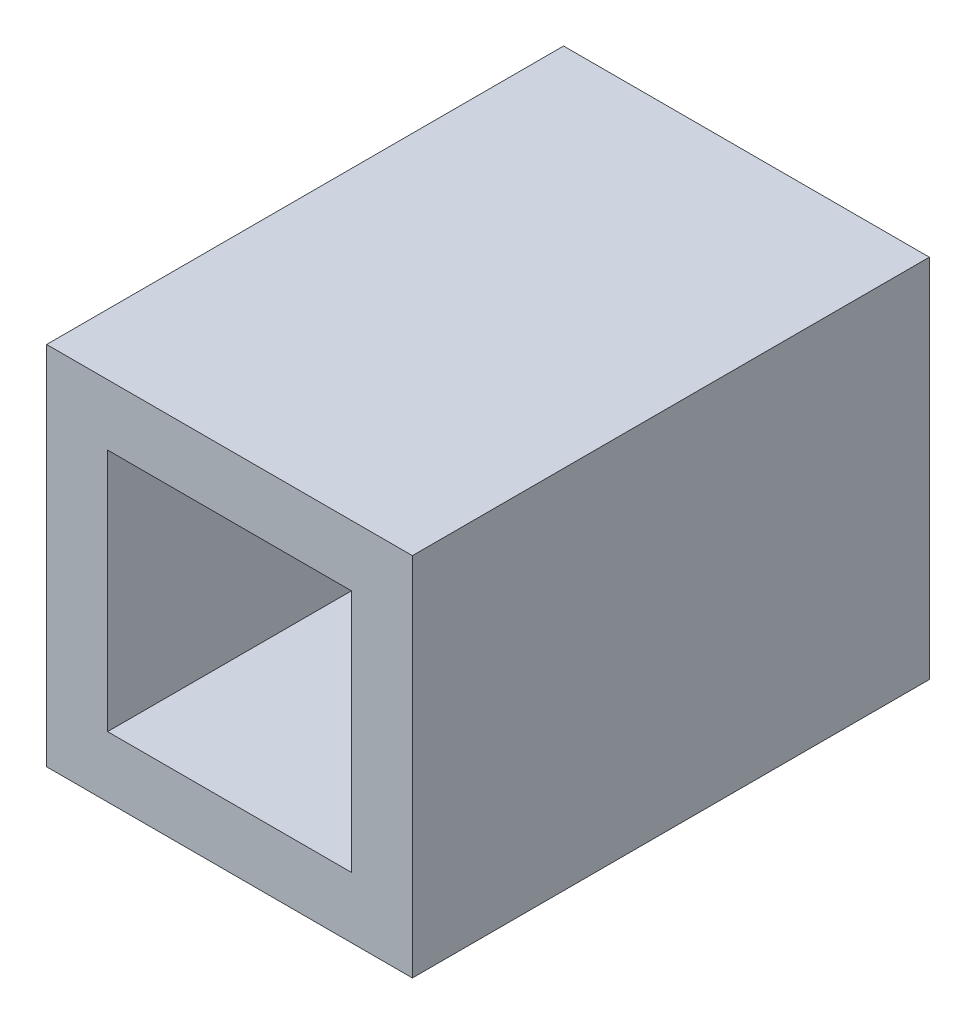
ISO-10303-21;
HEADER;
FILE_DESCRIPTION(('STEP AP214'),'2;1');
FILE_NAME('part.step','',(''),(''),'','','');
FILE_SCHEMA(('AUTOMOTIVE_DESIGN { 1 0 10303 214 1 1 1 1 }'));
ENDSEC;
DATA;
#1=APPLICATION_CONTEXT('core data for automotive mechanical design processes');
#2=APPLICATION_PROTOCOL_DEFINITION('international standard','automotive_design',2000,#1);
#3=PRODUCT_CONTEXT('',#1,'mechanical');
#4=PRODUCT('Part','Part','',(#3));
#5=PRODUCT_RELATED_PRODUCT_CATEGORY('part','',(#4));
#6=PRODUCT_DEFINITION_FORMATION('','',#4);
#7=PRODUCT_DEFINITION_CONTEXT('part definition',#1,'design');
#8=PRODUCT_DEFINITION('design','',#6,#7);
#9=PRODUCT_DEFINITION_SHAPE('','',#8);
#10=(LENGTH_UNIT() NAMED_UNIT(*) SI_UNIT(.MILLI.,.METRE.));
#11=(NAMED_UNIT(*) PLANE_ANGLE_UNIT() SI_UNIT($,.RADIAN.));
#12=(NAMED_UNIT(*) SI_UNIT($,.STERADIAN.) SOLID_ANGLE_UNIT());
#13=UNCERTAINTY_MEASURE_WITH_UNIT(LENGTH_MEASURE(1.E-05),#10,'distance_accuracy_value','');
#14=(GEOMETRIC_REPRESENTATION_CONTEXT(3) GLOBAL_UNCERTAINTY_ASSIGNED_CONTEXT((#13)) GLOBAL_UNIT_ASSIGNED_CONTEXT((#10,
#11,#12)) REPRESENTATION_CONTEXT('',''));
#15=CARTESIAN_POINT('',(0.,0.,0.));
#16=DIRECTION('',(0.,0.,1.));
#17=DIRECTION('',(1.,0.,0.));
#18=AXIS2_PLACEMENT_3D('',#15,#16,#17);
#19=CARTESIAN_POINT('',(0.,0.,42.4));
#20=DIRECTION('',(0.,0.,1.));
#21=DIRECTION('',(1.,0.,0.));
#22=AXIS2_PLACEMENT_3D('',#19,#20,#21);
#23=PLANE('',#22);
#24=DIRECTION('',(0.,1.,0.));
#25=VECTOR('',#24,1.);
#26=CARTESIAN_POINT('',(15.,15.,42.4));
#27=LINE('',#26,#25);
#28=CARTESIAN_POINT('',(15.,-15.,42.4));
#29=VERTEX_POINT('',#28);
#30=CARTESIAN_POINT('',(15.,15.,42.4));
#31=VERTEX_POINT('',#30);
#32=EDGE_CURVE('E134',#29,#31,#27,.T.);
#33=ORIENTED_EDGE('',*,*,#32,.T.);
#34=DIRECTION('',(-1.,0.,0.));
#35=VECTOR('',#34,1.);
#36=CARTESIAN_POINT('',(-15.,15.,42.4));
#37=LINE('',#36,#35);
#38=CARTESIAN_POINT('',(-15.,15.,42.4));
#39=VERTEX_POINT('',#38);
#40=EDGE_CURVE('E137',#31,#39,#37,.T.);
#41=ORIENTED_EDGE('',*,*,#40,.T.);
#42=DIRECTION('',(0.,-1.,0.));
#43=VECTOR('',#42,1.);
#44=CARTESIAN_POINT('',(-15.,15.,42.4));
#45=LINE('',#44,#43);
#46=CARTESIAN_POINT('',(-15.,-15.,42.4));
#47=VERTEX_POINT('',#46);
#48=EDGE_CURVE('E140',#39,#47,#45,.T.);
#49=ORIENTED_EDGE('',*,*,#48,.T.);
#50=DIRECTION('',(1.,0.,0.));
#51=VECTOR('',#50,1.);
#52=CARTESIAN_POINT('',(-15.,-15.,42.4));
#53=LINE('',#52,#51);
#54=EDGE_CURVE('E142',#47,#29,#53,.T.);
#55=ORIENTED_EDGE('',*,*,#54,.T.);
#56=EDGE_LOOP('',(#33,#41,#49,#55));
#57=FACE_BOUND('',#56,.T.);
#58=DIRECTION('',(-1.,0.,0.));
#59=VECTOR('',#58,1.);
#60=CARTESIAN_POINT('',(-10.,10.,42.4));
#61=LINE('',#60,#59);
#62=CARTESIAN_POINT('',(10.,10.,42.4));
#63=VERTEX_POINT('',#62);
#64=CARTESIAN_POINT('',(-10.,10.,42.4));
#65=VERTEX_POINT('',#64);
#66=EDGE_CURVE('E106',#63,#65,#61,.T.);
#67=ORIENTED_EDGE('',*,*,#66,.F.);
#68=DIRECTION('',(0.,1.,0.));
#69=VECTOR('',#68,1.);
#70=CARTESIAN_POINT('',(10.,10.,42.4));
#71=LINE('',#70,#69);
#72=CARTESIAN_POINT('',(10.,-10.,42.4));
#73=VERTEX_POINT('',#72);
#74=EDGE_CURVE('E98',#73,#63,#71,.T.);
#75=ORIENTED_EDGE('',*,*,#74,.F.);
#76=DIRECTION('',(1.,0.,0.));
#77=VECTOR('',#76,1.);
#78=CARTESIAN_POINT('',(-10.,-10.,42.4));
#79=LINE('',#78,#77);
#80=CARTESIAN_POINT('',(-10.,-10.,42.4));
#81=VERTEX_POINT('',#80);
#82=EDGE_CURVE('E120',#81,#73,#79,.T.);
#83=ORIENTED_EDGE('',*,*,#82,.F.);
#84=DIRECTION('',(0.,-1.,0.));
#85=VECTOR('',#84,1.);
#86=CARTESIAN_POINT('',(-10.,10.,42.4));
#87=LINE('',#86,#85);
#88=EDGE_CURVE('E118',#65,#81,#87,.T.);
#89=ORIENTED_EDGE('',*,*,#88,.F.);
#90=EDGE_LOOP('',(#67,#75,#83,#89));
#91=FACE_BOUND('',#90,.T.);
#92=ADVANCED_FACE('F33',(#57,#91),#23,.T.);
#93=CARTESIAN_POINT('',(0.,0.,0.));
#94=DIRECTION('',(0.,0.,1.));
#95=DIRECTION('',(1.,0.,0.));
#96=AXIS2_PLACEMENT_3D('',#93,#94,#95);
#97=PLANE('',#96);
#98=DIRECTION('',(0.,1.,0.));
#99=VECTOR('',#98,1.);
#100=CARTESIAN_POINT('',(15.,15.,0.));
#101=LINE('',#100,#99);
#102=CARTESIAN_POINT('',(15.,-15.,0.));
#103=VERTEX_POINT('',#102);
#104=CARTESIAN_POINT('',(15.,15.,0.));
#105=VERTEX_POINT('',#104);
#106=EDGE_CURVE('E114',#103,#105,#101,.T.);
#107=ORIENTED_EDGE('',*,*,#106,.F.);
#108=DIRECTION('',(1.,0.,0.));
#109=VECTOR('',#108,1.);
#110=CARTESIAN_POINT('',(-15.,-15.,0.));
#111=LINE('',#110,#109);
#112=CARTESIAN_POINT('',(-15.,-15.,0.));
#113=VERTEX_POINT('',#112);
#114=EDGE_CURVE('E138',#113,#103,#111,.T.);
#115=ORIENTED_EDGE('',*,*,#114,.F.);
#116=DIRECTION('',(0.,-1.,0.));
#117=VECTOR('',#116,1.);
#118=CARTESIAN_POINT('',(-15.,15.,0.));
#119=LINE('',#118,#117);
#120=CARTESIAN_POINT('',(-15.,15.,0.));
#121=VERTEX_POINT('',#120);
#122=EDGE_CURVE('E149',#121,#113,#119,.T.);
#123=ORIENTED_EDGE('',*,*,#122,.F.);
#124=DIRECTION('',(-1.,0.,0.));
#125=VECTOR('',#124,1.);
#126=CARTESIAN_POINT('',(-15.,15.,0.));
#127=LINE('',#126,#125);
#128=EDGE_CURVE('E147',#105,#121,#127,.T.);
#129=ORIENTED_EDGE('',*,*,#128,.F.);
#130=EDGE_LOOP('',(#107,#115,#123,#129));
#131=FACE_BOUND('',#130,.T.);
#132=DIRECTION('',(0.,1.,0.));
#133=VECTOR('',#132,1.);
#134=CARTESIAN_POINT('',(10.,10.,0.));
#135=LINE('',#134,#133);
#136=CARTESIAN_POINT('',(10.,-10.,0.));
#137=VERTEX_POINT('',#136);
#138=CARTESIAN_POINT('',(10.,10.,0.));
#139=VERTEX_POINT('',#138);
#140=EDGE_CURVE('E56',#137,#139,#135,.T.);
#141=ORIENTED_EDGE('',*,*,#140,.T.);
#142=DIRECTION('',(-1.,0.,0.));
#143=VECTOR('',#142,1.);
#144=CARTESIAN_POINT('',(-10.,10.,0.));
#145=LINE('',#144,#143);
#146=CARTESIAN_POINT('',(-10.,10.,0.));
#147=VERTEX_POINT('',#146);
#148=EDGE_CURVE('E113',#139,#147,#145,.T.);
#149=ORIENTED_EDGE('',*,*,#148,.T.);
#150=DIRECTION('',(0.,-1.,0.));
#151=VECTOR('',#150,1.);
#152=CARTESIAN_POINT('',(-10.,10.,0.));
#153=LINE('',#152,#151);
#154=CARTESIAN_POINT('',(-10.,-10.,0.));
#155=VERTEX_POINT('',#154);
#156=EDGE_CURVE('E126',#147,#155,#153,.T.);
#157=ORIENTED_EDGE('',*,*,#156,.T.);
#158=DIRECTION('',(1.,0.,0.));
#159=VECTOR('',#158,1.);
#160=CARTESIAN_POINT('',(-10.,-10.,0.));
#161=LINE('',#160,#159);
#162=EDGE_CURVE('E107',#155,#137,#161,.T.);
#163=ORIENTED_EDGE('',*,*,#162,.T.);
#164=EDGE_LOOP('',(#141,#149,#157,#163));
#165=FACE_BOUND('',#164,.T.);
#166=ADVANCED_FACE('F167',(#131,#165),#97,.F.);
#167=CARTESIAN_POINT('',(15.,15.,42.4));
#168=DIRECTION('',(-1.,0.,0.));
#169=DIRECTION('',(0.,0.,1.));
#170=AXIS2_PLACEMENT_3D('',#167,#168,#169);
#171=PLANE('',#170);
#172=ORIENTED_EDGE('',*,*,#106,.T.);
#173=DIRECTION('',(0.,0.,-1.));
#174=VECTOR('',#173,1.);
#175=CARTESIAN_POINT('',(15.,15.,42.4));
#176=LINE('',#175,#174);
#177=EDGE_CURVE('E11',#31,#105,#176,.T.);
#178=ORIENTED_EDGE('',*,*,#177,.F.);
#179=ORIENTED_EDGE('',*,*,#32,.F.);
#180=DIRECTION('',(0.,0.,-1.));
#181=VECTOR('',#180,1.);
#182=CARTESIAN_POINT('',(15.,-15.,42.4));
#183=LINE('',#182,#181);
#184=EDGE_CURVE('E144',#29,#103,#183,.T.);
#185=ORIENTED_EDGE('',*,*,#184,.T.);
#186=EDGE_LOOP('',(#172,#178,#179,#185));
#187=FACE_BOUND('',#186,.T.);
#188=ADVANCED_FACE('F35',(#187),#171,.F.);
#189=CARTESIAN_POINT('',(-15.,15.,42.4));
#190=DIRECTION('',(0.,-1.,0.));
#191=DIRECTION('',(0.,0.,-1.));
#192=AXIS2_PLACEMENT_3D('',#189,#190,#191);
#193=PLANE('',#192);
#194=ORIENTED_EDGE('',*,*,#128,.T.);
#195=DIRECTION('',(0.,0.,-1.));
#196=VECTOR('',#195,1.);
#197=CARTESIAN_POINT('',(-15.,15.,42.4));
#198=LINE('',#197,#196);
#199=EDGE_CURVE('E41',#39,#121,#198,.T.);
#200=ORIENTED_EDGE('',*,*,#199,.F.);
#201=ORIENTED_EDGE('',*,*,#40,.F.);
#202=ORIENTED_EDGE('',*,*,#177,.T.);
#203=EDGE_LOOP('',(#194,#200,#201,#202));
#204=FACE_BOUND('',#203,.T.);
#205=ADVANCED_FACE('F177',(#204),#193,.F.);
#206=CARTESIAN_POINT('',(-15.,15.,42.4));
#207=DIRECTION('',(1.,0.,0.));
#208=DIRECTION('',(0.,0.,-1.));
#209=AXIS2_PLACEMENT_3D('',#206,#207,#208);
#210=PLANE('',#209);
#211=ORIENTED_EDGE('',*,*,#122,.T.);
#212=DIRECTION('',(0.,0.,-1.));
#213=VECTOR('',#212,1.);
#214=CARTESIAN_POINT('',(-15.,-15.,42.4));
#215=LINE('',#214,#213);
#216=EDGE_CURVE('E154',#47,#113,#215,.T.);
#217=ORIENTED_EDGE('',*,*,#216,.F.);
#218=ORIENTED_EDGE('',*,*,#48,.F.);
#219=ORIENTED_EDGE('',*,*,#199,.T.);
#220=EDGE_LOOP('',(#211,#217,#218,#219));
#221=FACE_BOUND('',#220,.T.);
#222=ADVANCED_FACE('F161',(#221),#210,.F.);
#223=CARTESIAN_POINT('',(-15.,-15.,42.4));
#224=DIRECTION('',(0.,1.,0.));
#225=DIRECTION('',(0.,0.,1.));
#226=AXIS2_PLACEMENT_3D('',#223,#224,#225);
#227=PLANE('',#226);
#228=ORIENTED_EDGE('',*,*,#114,.T.);
#229=ORIENTED_EDGE('',*,*,#184,.F.);
#230=ORIENTED_EDGE('',*,*,#54,.F.);
#231=ORIENTED_EDGE('',*,*,#216,.T.);
#232=EDGE_LOOP('',(#228,#229,#230,#231));
#233=FACE_BOUND('',#232,.T.);
#234=ADVANCED_FACE('F171',(#233),#227,.F.);
#235=CARTESIAN_POINT('',(10.,10.,42.4));
#236=DIRECTION('',(-1.,0.,0.));
#237=DIRECTION('',(0.,0.,1.));
#238=AXIS2_PLACEMENT_3D('',#235,#236,#237);
#239=PLANE('',#238);
#240=ORIENTED_EDGE('',*,*,#140,.F.);
#241=DIRECTION('',(0.,0.,-1.));
#242=VECTOR('',#241,1.);
#243=CARTESIAN_POINT('',(10.,-10.,42.4));
#244=LINE('',#243,#242);
#245=EDGE_CURVE('E102',#73,#137,#244,.T.);
#246=ORIENTED_EDGE('',*,*,#245,.F.);
#247=ORIENTED_EDGE('',*,*,#74,.T.);
#248=DIRECTION('',(0.,0.,-1.));
#249=VECTOR('',#248,1.);
#250=CARTESIAN_POINT('',(10.,10.,42.4));
#251=LINE('',#250,#249);
#252=EDGE_CURVE('E101',#63,#139,#251,.T.);
#253=ORIENTED_EDGE('',*,*,#252,.T.);
#254=EDGE_LOOP('',(#240,#246,#247,#253));
#255=FACE_BOUND('',#254,.T.);
#256=ADVANCED_FACE('F100',(#255),#239,.T.);
#257=CARTESIAN_POINT('',(-10.,10.,42.4));
#258=DIRECTION('',(0.,-1.,0.));
#259=DIRECTION('',(0.,0.,-1.));
#260=AXIS2_PLACEMENT_3D('',#257,#258,#259);
#261=PLANE('',#260);
#262=ORIENTED_EDGE('',*,*,#148,.F.);
#263=ORIENTED_EDGE('',*,*,#252,.F.);
#264=ORIENTED_EDGE('',*,*,#66,.T.);
#265=DIRECTION('',(0.,0.,-1.));
#266=VECTOR('',#265,1.);
#267=CARTESIAN_POINT('',(-10.,10.,42.4));
#268=LINE('',#267,#266);
#269=EDGE_CURVE('E115',#65,#147,#268,.T.);
#270=ORIENTED_EDGE('',*,*,#269,.T.);
#271=EDGE_LOOP('',(#262,#263,#264,#270));
#272=FACE_BOUND('',#271,.T.);
#273=ADVANCED_FACE('F110',(#272),#261,.T.);
#274=CARTESIAN_POINT('',(-10.,10.,42.4));
#275=DIRECTION('',(1.,0.,0.));
#276=DIRECTION('',(0.,0.,-1.));
#277=AXIS2_PLACEMENT_3D('',#274,#275,#276);
#278=PLANE('',#277);
#279=ORIENTED_EDGE('',*,*,#156,.F.);
#280=ORIENTED_EDGE('',*,*,#269,.F.);
#281=ORIENTED_EDGE('',*,*,#88,.T.);
#282=DIRECTION('',(0.,0.,-1.));
#283=VECTOR('',#282,1.);
#284=CARTESIAN_POINT('',(-10.,-10.,42.4));
#285=LINE('',#284,#283);
#286=EDGE_CURVE('E48',#81,#155,#285,.T.);
#287=ORIENTED_EDGE('',*,*,#286,.T.);
#288=EDGE_LOOP('',(#279,#280,#281,#287));
#289=FACE_BOUND('',#288,.T.);
#290=ADVANCED_FACE('F200',(#289),#278,.T.);
#291=CARTESIAN_POINT('',(-10.,-10.,42.4));
#292=DIRECTION('',(0.,1.,0.));
#293=DIRECTION('',(0.,0.,1.));
#294=AXIS2_PLACEMENT_3D('',#291,#292,#293);
#295=PLANE('',#294);
#296=ORIENTED_EDGE('',*,*,#162,.F.);
#297=ORIENTED_EDGE('',*,*,#286,.F.);
#298=ORIENTED_EDGE('',*,*,#82,.T.);
#299=ORIENTED_EDGE('',*,*,#245,.T.);
#300=EDGE_LOOP('',(#296,#297,#298,#299));
#301=FACE_BOUND('',#300,.T.);
#302=ADVANCED_FACE('F204',(#301),#295,.T.);
#303=CLOSED_SHELL('',(#92,#166,#188,#205,#222,#234,#256,#273,#290,#302));
#304=MANIFOLD_SOLID_BREP('B2',#303);
#305=ADVANCED_BREP_SHAPE_REPRESENTATION('',(#18,#304),#14);
#306=SHAPE_DEFINITION_REPRESENTATION(#9,#305);
ENDSEC;
END-ISO-10303-21;
